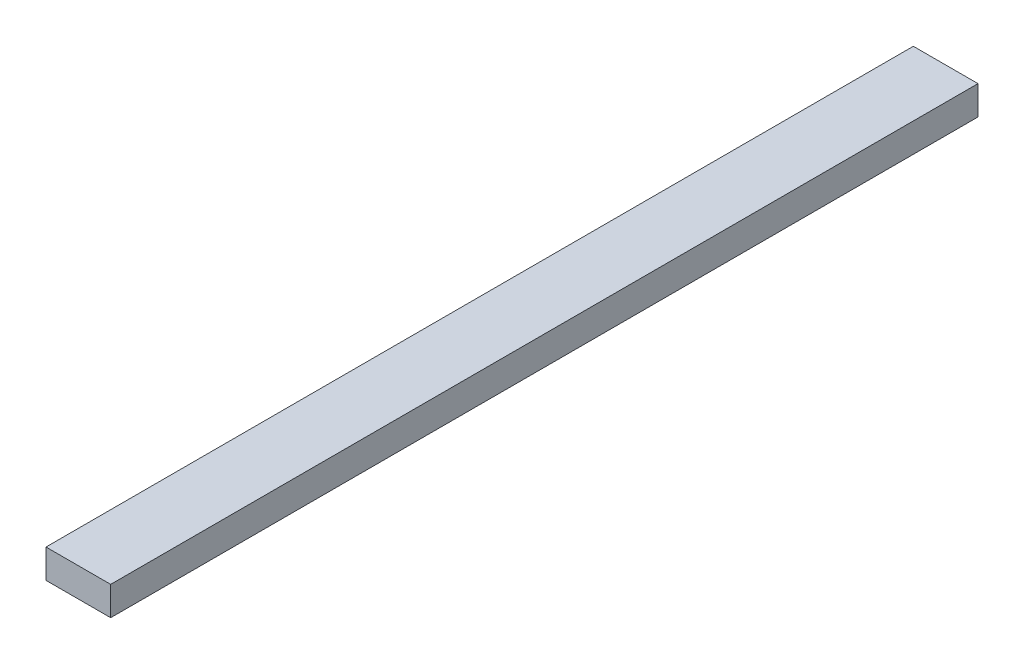
ISO-10303-21;
HEADER;
FILE_DESCRIPTION(('STEP AP214'),'2;1');
FILE_NAME('part.step','',(''),(''),'','','');
FILE_SCHEMA(('AUTOMOTIVE_DESIGN { 1 0 10303 214 1 1 1 1 }'));
ENDSEC;
DATA;
#1=APPLICATION_CONTEXT('core data for automotive mechanical design processes');
#2=APPLICATION_PROTOCOL_DEFINITION('international standard','automotive_design',2000,#1);
#3=PRODUCT_CONTEXT('',#1,'mechanical');
#4=PRODUCT('Part','Part','',(#3));
#5=PRODUCT_RELATED_PRODUCT_CATEGORY('part','',(#4));
#6=PRODUCT_DEFINITION_FORMATION('','',#4);
#7=PRODUCT_DEFINITION_CONTEXT('part definition',#1,'design');
#8=PRODUCT_DEFINITION('design','',#6,#7);
#9=PRODUCT_DEFINITION_SHAPE('','',#8);
#10=(LENGTH_UNIT() NAMED_UNIT(*) SI_UNIT(.MILLI.,.METRE.));
#11=(NAMED_UNIT(*) PLANE_ANGLE_UNIT() SI_UNIT($,.RADIAN.));
#12=(NAMED_UNIT(*) SI_UNIT($,.STERADIAN.) SOLID_ANGLE_UNIT());
#13=UNCERTAINTY_MEASURE_WITH_UNIT(LENGTH_MEASURE(1.E-05),#10,'distance_accuracy_value','');
#14=(GEOMETRIC_REPRESENTATION_CONTEXT(3) GLOBAL_UNCERTAINTY_ASSIGNED_CONTEXT((#13)) GLOBAL_UNIT_ASSIGNED_CONTEXT((#10,
#11,#12)) REPRESENTATION_CONTEXT('',''));
#15=CARTESIAN_POINT('',(0.,0.,0.));
#16=DIRECTION('',(0.,0.,1.));
#17=DIRECTION('',(1.,0.,0.));
#18=AXIS2_PLACEMENT_3D('',#15,#16,#17);
#19=CARTESIAN_POINT('',(18.6436,8.3312,250.));
#20=DIRECTION('',(0.,-1.,0.));
#21=DIRECTION('',(0.,0.,-1.));
#22=AXIS2_PLACEMENT_3D('',#19,#20,#21);
#23=PLANE('',#22);
#24=DIRECTION('',(-1.,0.,0.));
#25=VECTOR('',#24,1.);
#26=CARTESIAN_POINT('',(18.6436,8.3312,-250.));
#27=LINE('',#26,#25);
#28=CARTESIAN_POINT('',(18.6436,8.3312,-250.));
#29=VERTEX_POINT('',#28);
#30=CARTESIAN_POINT('',(-18.6436,8.3312,-250.));
#31=VERTEX_POINT('',#30);
#32=EDGE_CURVE('E103',#29,#31,#27,.T.);
#33=ORIENTED_EDGE('',*,*,#32,.T.);
#34=DIRECTION('',(0.,0.,-1.));
#35=VECTOR('',#34,1.);
#36=CARTESIAN_POINT('',(-18.6436,8.3312,250.));
#37=LINE('',#36,#35);
#38=CARTESIAN_POINT('',(-18.6436,8.3312,250.));
#39=VERTEX_POINT('',#38);
#40=EDGE_CURVE('E11',#39,#31,#37,.T.);
#41=ORIENTED_EDGE('',*,*,#40,.F.);
#42=DIRECTION('',(-1.,0.,0.));
#43=VECTOR('',#42,1.);
#44=CARTESIAN_POINT('',(18.6436,8.3312,250.));
#45=LINE('',#44,#43);
#46=CARTESIAN_POINT('',(18.6436,8.3312,250.));
#47=VERTEX_POINT('',#46);
#48=EDGE_CURVE('E93',#47,#39,#45,.T.);
#49=ORIENTED_EDGE('',*,*,#48,.F.);
#50=DIRECTION('',(0.,0.,-1.));
#51=VECTOR('',#50,1.);
#52=CARTESIAN_POINT('',(18.6436,8.3312,250.));
#53=LINE('',#52,#51);
#54=EDGE_CURVE('E97',#47,#29,#53,.T.);
#55=ORIENTED_EDGE('',*,*,#54,.T.);
#56=EDGE_LOOP('',(#33,#41,#49,#55));
#57=FACE_BOUND('',#56,.T.);
#58=ADVANCED_FACE('F37',(#57),#23,.F.);
#59=CARTESIAN_POINT('',(-18.6436,-8.3312,250.));
#60=DIRECTION('',(1.,0.,0.));
#61=DIRECTION('',(0.,0.,-1.));
#62=AXIS2_PLACEMENT_3D('',#59,#60,#61);
#63=PLANE('',#62);
#64=DIRECTION('',(0.,-1.,0.));
#65=VECTOR('',#64,1.);
#66=CARTESIAN_POINT('',(-18.6436,-8.3312,-250.));
#67=LINE('',#66,#65);
#68=CARTESIAN_POINT('',(-18.6436,-8.3312,-250.));
#69=VERTEX_POINT('',#68);
#70=EDGE_CURVE('E92',#31,#69,#67,.T.);
#71=ORIENTED_EDGE('',*,*,#70,.T.);
#72=DIRECTION('',(0.,0.,-1.));
#73=VECTOR('',#72,1.);
#74=CARTESIAN_POINT('',(-18.6436,-8.3312,250.));
#75=LINE('',#74,#73);
#76=CARTESIAN_POINT('',(-18.6436,-8.3312,250.));
#77=VERTEX_POINT('',#76);
#78=EDGE_CURVE('E48',#77,#69,#75,.T.);
#79=ORIENTED_EDGE('',*,*,#78,.F.);
#80=DIRECTION('',(0.,-1.,0.));
#81=VECTOR('',#80,1.);
#82=CARTESIAN_POINT('',(-18.6436,-8.3312,250.));
#83=LINE('',#82,#81);
#84=EDGE_CURVE('E88',#39,#77,#83,.T.);
#85=ORIENTED_EDGE('',*,*,#84,.F.);
#86=ORIENTED_EDGE('',*,*,#40,.T.);
#87=EDGE_LOOP('',(#71,#79,#85,#86));
#88=FACE_BOUND('',#87,.T.);
#89=ADVANCED_FACE('F94',(#88),#63,.F.);
#90=CARTESIAN_POINT('',(18.6436,-8.3312,250.));
#91=DIRECTION('',(0.,1.,0.));
#92=DIRECTION('',(0.,0.,1.));
#93=AXIS2_PLACEMENT_3D('',#90,#91,#92);
#94=PLANE('',#93);
#95=DIRECTION('',(1.,0.,0.));
#96=VECTOR('',#95,1.);
#97=CARTESIAN_POINT('',(18.6436,-8.3312,-250.));
#98=LINE('',#97,#96);
#99=CARTESIAN_POINT('',(18.6436,-8.3312,-250.));
#100=VERTEX_POINT('',#99);
#101=EDGE_CURVE('E71',#69,#100,#98,.T.);
#102=ORIENTED_EDGE('',*,*,#101,.T.);
#103=DIRECTION('',(0.,0.,-1.));
#104=VECTOR('',#103,1.);
#105=CARTESIAN_POINT('',(18.6436,-8.3312,250.));
#106=LINE('',#105,#104);
#107=CARTESIAN_POINT('',(18.6436,-8.3312,250.));
#108=VERTEX_POINT('',#107);
#109=EDGE_CURVE('E96',#108,#100,#106,.T.);
#110=ORIENTED_EDGE('',*,*,#109,.F.);
#111=DIRECTION('',(1.,0.,0.));
#112=VECTOR('',#111,1.);
#113=CARTESIAN_POINT('',(18.6436,-8.3312,250.));
#114=LINE('',#113,#112);
#115=EDGE_CURVE('E90',#77,#108,#114,.T.);
#116=ORIENTED_EDGE('',*,*,#115,.F.);
#117=ORIENTED_EDGE('',*,*,#78,.T.);
#118=EDGE_LOOP('',(#102,#110,#116,#117));
#119=FACE_BOUND('',#118,.T.);
#120=ADVANCED_FACE('F100',(#119),#94,.F.);
#121=CARTESIAN_POINT('',(18.6436,-8.3312,250.));
#122=DIRECTION('',(-1.,0.,0.));
#123=DIRECTION('',(0.,0.,1.));
#124=AXIS2_PLACEMENT_3D('',#121,#122,#123);
#125=PLANE('',#124);
#126=DIRECTION('',(0.,1.,0.));
#127=VECTOR('',#126,1.);
#128=CARTESIAN_POINT('',(18.6436,-8.3312,-250.));
#129=LINE('',#128,#127);
#130=EDGE_CURVE('E78',#100,#29,#129,.T.);
#131=ORIENTED_EDGE('',*,*,#130,.T.);
#132=ORIENTED_EDGE('',*,*,#54,.F.);
#133=DIRECTION('',(0.,1.,0.));
#134=VECTOR('',#133,1.);
#135=CARTESIAN_POINT('',(18.6436,-8.3312,250.));
#136=LINE('',#135,#134);
#137=EDGE_CURVE('E57',#108,#47,#136,.T.);
#138=ORIENTED_EDGE('',*,*,#137,.F.);
#139=ORIENTED_EDGE('',*,*,#109,.T.);
#140=EDGE_LOOP('',(#131,#132,#138,#139));
#141=FACE_BOUND('',#140,.T.);
#142=ADVANCED_FACE('F109',(#141),#125,.F.);
#143=CARTESIAN_POINT('',(0.,0.,250.));
#144=DIRECTION('',(0.,0.,-1.));
#145=DIRECTION('',(-1.,0.,0.));
#146=AXIS2_PLACEMENT_3D('',#143,#144,#145);
#147=PLANE('',#146);
#148=ORIENTED_EDGE('',*,*,#48,.T.);
#149=ORIENTED_EDGE('',*,*,#84,.T.);
#150=ORIENTED_EDGE('',*,*,#115,.T.);
#151=ORIENTED_EDGE('',*,*,#137,.T.);
#152=EDGE_LOOP('',(#148,#149,#150,#151));
#153=FACE_BOUND('',#152,.T.);
#154=ADVANCED_FACE('F87',(#153),#147,.F.);
#155=CARTESIAN_POINT('',(0.,0.,-250.));
#156=DIRECTION('',(0.,0.,-1.));
#157=DIRECTION('',(-1.,0.,0.));
#158=AXIS2_PLACEMENT_3D('',#155,#156,#157);
#159=PLANE('',#158);
#160=ORIENTED_EDGE('',*,*,#32,.F.);
#161=ORIENTED_EDGE('',*,*,#130,.F.);
#162=ORIENTED_EDGE('',*,*,#101,.F.);
#163=ORIENTED_EDGE('',*,*,#70,.F.);
#164=EDGE_LOOP('',(#160,#161,#162,#163));
#165=FACE_BOUND('',#164,.T.);
#166=ADVANCED_FACE('F114',(#165),#159,.T.);
#167=CLOSED_SHELL('',(#58,#89,#120,#142,#154,#166));
#168=MANIFOLD_SOLID_BREP('B2',#167);
#169=ADVANCED_BREP_SHAPE_REPRESENTATION('',(#18,#168),#14);
#170=SHAPE_DEFINITION_REPRESENTATION(#9,#169);
ENDSEC;
END-ISO-10303-21;
